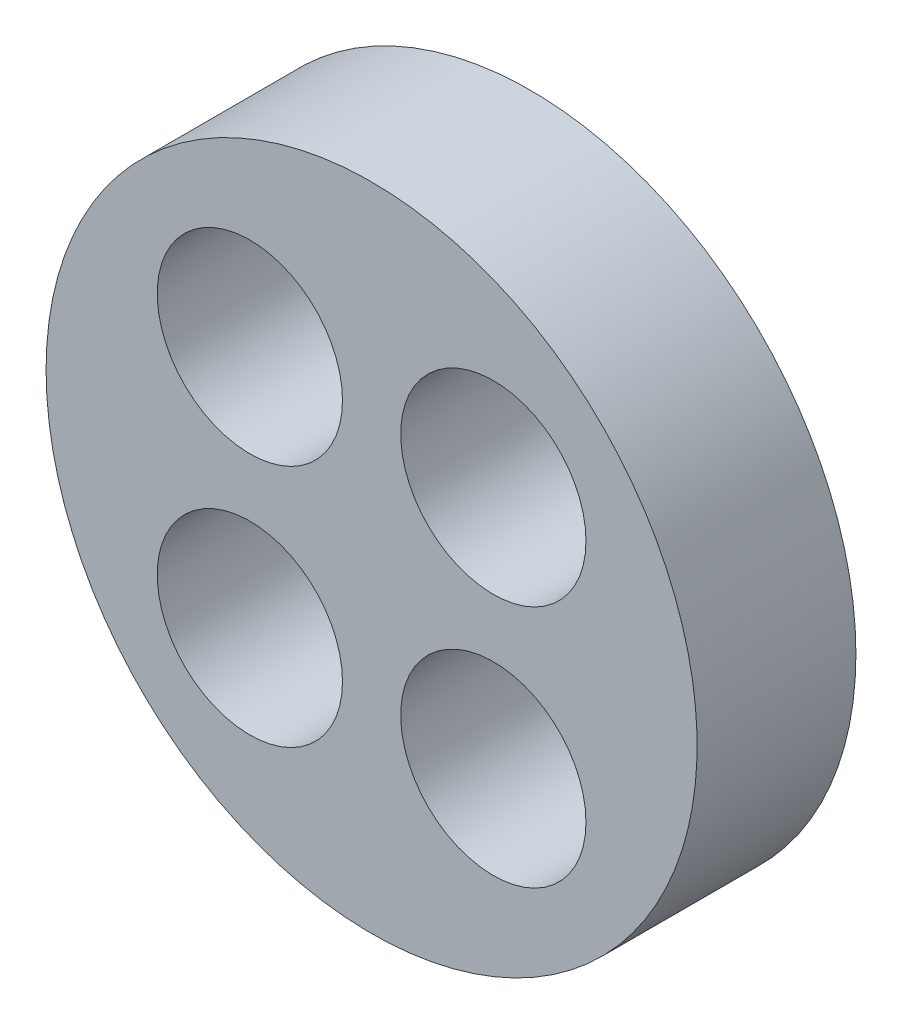
ISO-10303-21;
HEADER;
FILE_DESCRIPTION(('STEP AP214'),'2;1');
FILE_NAME('part.step','',(''),(''),'','','');
FILE_SCHEMA(('AUTOMOTIVE_DESIGN { 1 0 10303 214 1 1 1 1 }'));
ENDSEC;
DATA;
#1=APPLICATION_CONTEXT('core data for automotive mechanical design processes');
#2=APPLICATION_PROTOCOL_DEFINITION('international standard','automotive_design',2000,#1);
#3=PRODUCT_CONTEXT('',#1,'mechanical');
#4=PRODUCT('Part','Part','',(#3));
#5=PRODUCT_RELATED_PRODUCT_CATEGORY('part','',(#4));
#6=PRODUCT_DEFINITION_FORMATION('','',#4);
#7=PRODUCT_DEFINITION_CONTEXT('part definition',#1,'design');
#8=PRODUCT_DEFINITION('design','',#6,#7);
#9=PRODUCT_DEFINITION_SHAPE('','',#8);
#10=(LENGTH_UNIT() NAMED_UNIT(*) SI_UNIT(.MILLI.,.METRE.));
#11=(NAMED_UNIT(*) PLANE_ANGLE_UNIT() SI_UNIT($,.RADIAN.));
#12=(NAMED_UNIT(*) SI_UNIT($,.STERADIAN.) SOLID_ANGLE_UNIT());
#13=UNCERTAINTY_MEASURE_WITH_UNIT(LENGTH_MEASURE(1.E-05),#10,'distance_accuracy_value','');
#14=(GEOMETRIC_REPRESENTATION_CONTEXT(3) GLOBAL_UNCERTAINTY_ASSIGNED_CONTEXT((#13)) GLOBAL_UNIT_ASSIGNED_CONTEXT((#10,
#11,#12)) REPRESENTATION_CONTEXT('',''));
#15=CARTESIAN_POINT('',(0.,0.,0.));
#16=DIRECTION('',(0.,0.,1.));
#17=DIRECTION('',(1.,0.,0.));
#18=AXIS2_PLACEMENT_3D('',#15,#16,#17);
#19=CARTESIAN_POINT('',(0.,0.,0.));
#20=DIRECTION('',(0.,0.,-1.));
#21=DIRECTION('',(-1.,0.,0.));
#22=AXIS2_PLACEMENT_3D('',#19,#20,#21);
#23=PLANE('',#22);
#24=CARTESIAN_POINT('',(0.5842,0.5842,0.));
#25=DIRECTION('',(0.,0.,1.));
#26=DIRECTION('',(1.,0.,0.));
#27=AXIS2_PLACEMENT_3D('',#24,#25,#26);
#28=CIRCLE('',#27,0.44449999999999);
#29=CARTESIAN_POINT('',(1.02869999999999,0.5842,0.));
#30=VERTEX_POINT('',#29);
#31=EDGE_CURVE('E55',#30,#30,#28,.T.);
#32=ORIENTED_EDGE('',*,*,#31,.F.);
#33=EDGE_LOOP('',(#32));
#34=FACE_BOUND('',#33,.T.);
#35=CARTESIAN_POINT('',(-0.5842,0.5842,0.));
#36=DIRECTION('',(0.,0.,1.));
#37=DIRECTION('',(1.,0.,0.));
#38=AXIS2_PLACEMENT_3D('',#35,#36,#37);
#39=CIRCLE('',#38,0.44449999999999);
#40=CARTESIAN_POINT('',(-0.13970000000001,0.5842,0.));
#41=VERTEX_POINT('',#40);
#42=EDGE_CURVE('E52',#41,#41,#39,.T.);
#43=ORIENTED_EDGE('',*,*,#42,.F.);
#44=EDGE_LOOP('',(#43));
#45=FACE_BOUND('',#44,.T.);
#46=CARTESIAN_POINT('',(-0.5842,-0.5842,0.));
#47=DIRECTION('',(0.,0.,1.));
#48=DIRECTION('',(1.,0.,0.));
#49=AXIS2_PLACEMENT_3D('',#46,#47,#48);
#50=CIRCLE('',#49,0.44449999999999);
#51=CARTESIAN_POINT('',(-0.13970000000001,-0.5842,0.));
#52=VERTEX_POINT('',#51);
#53=EDGE_CURVE('E47',#52,#52,#50,.T.);
#54=ORIENTED_EDGE('',*,*,#53,.F.);
#55=EDGE_LOOP('',(#54));
#56=FACE_BOUND('',#55,.T.);
#57=CARTESIAN_POINT('',(0.5842,-0.5842,0.));
#58=DIRECTION('',(0.,0.,1.));
#59=DIRECTION('',(1.,0.,0.));
#60=AXIS2_PLACEMENT_3D('',#57,#58,#59);
#61=CIRCLE('',#60,0.44449999999999);
#62=CARTESIAN_POINT('',(1.02869999999999,-0.5842,0.));
#63=VERTEX_POINT('',#62);
#64=EDGE_CURVE('E43',#63,#63,#61,.T.);
#65=ORIENTED_EDGE('',*,*,#64,.F.);
#66=EDGE_LOOP('',(#65));
#67=FACE_BOUND('',#66,.T.);
#68=CARTESIAN_POINT('',(0.,0.,0.));
#69=DIRECTION('',(0.,0.,-1.));
#70=DIRECTION('',(-1.,0.,0.));
#71=AXIS2_PLACEMENT_3D('',#68,#69,#70);
#72=CIRCLE('',#71,1.5621);
#73=CARTESIAN_POINT('',(-1.5621,0.,0.));
#74=VERTEX_POINT('',#73);
#75=EDGE_CURVE('E11',#74,#74,#72,.T.);
#76=ORIENTED_EDGE('',*,*,#75,.F.);
#77=EDGE_LOOP('',(#76));
#78=FACE_BOUND('',#77,.T.);
#79=ADVANCED_FACE('F36',(#34,#45,#56,#67,#78),#23,.F.);
#80=CARTESIAN_POINT('',(0.,0.,1.43218634124764));
#81=DIRECTION('',(0.,0.,-1.));
#82=DIRECTION('',(-1.,0.,0.));
#83=AXIS2_PLACEMENT_3D('',#80,#81,#82);
#84=CYLINDRICAL_SURFACE('',#83,1.5621);
#85=CARTESIAN_POINT('',(0.,0.,-0.762000000000001));
#86=DIRECTION('',(0.,0.,1.));
#87=DIRECTION('',(1.,0.,0.));
#88=AXIS2_PLACEMENT_3D('',#85,#86,#87);
#89=CIRCLE('',#88,1.5621);
#90=CARTESIAN_POINT('',(1.5621,0.,-0.762000000000001));
#91=VERTEX_POINT('',#90);
#92=EDGE_CURVE('E57',#91,#91,#89,.T.);
#93=ORIENTED_EDGE('',*,*,#92,.T.);
#94=EDGE_LOOP('',(#93));
#95=FACE_BOUND('',#94,.T.);
#96=ORIENTED_EDGE('',*,*,#75,.T.);
#97=EDGE_LOOP('',(#96));
#98=FACE_BOUND('',#97,.T.);
#99=ADVANCED_FACE('F94',(#95,#98),#84,.T.);
#100=CARTESIAN_POINT('',(0.5842,-0.5842,0.));
#101=DIRECTION('',(0.,0.,1.));
#102=DIRECTION('',(1.,0.,0.));
#103=AXIS2_PLACEMENT_3D('',#100,#101,#102);
#104=CYLINDRICAL_SURFACE('',#103,0.444499999999989);
#105=CARTESIAN_POINT('',(0.5842,-0.5842,-0.762000000000001));
#106=DIRECTION('',(0.,0.,1.));
#107=DIRECTION('',(1.,0.,0.));
#108=AXIS2_PLACEMENT_3D('',#105,#106,#107);
#109=CIRCLE('',#108,0.444499999999989);
#110=CARTESIAN_POINT('',(1.02869999999999,-0.5842,-0.762000000000001));
#111=VERTEX_POINT('',#110);
#112=EDGE_CURVE('E62',#111,#111,#109,.F.);
#113=ORIENTED_EDGE('',*,*,#112,.T.);
#114=EDGE_LOOP('',(#113));
#115=FACE_BOUND('',#114,.T.);
#116=ORIENTED_EDGE('',*,*,#64,.T.);
#117=EDGE_LOOP('',(#116));
#118=FACE_BOUND('',#117,.T.);
#119=ADVANCED_FACE('F96',(#115,#118),#104,.F.);
#120=CARTESIAN_POINT('',(-0.5842,-0.5842,0.));
#121=DIRECTION('',(0.,0.,1.));
#122=DIRECTION('',(1.,0.,0.));
#123=AXIS2_PLACEMENT_3D('',#120,#121,#122);
#124=CYLINDRICAL_SURFACE('',#123,0.444499999999989);
#125=CARTESIAN_POINT('',(-0.5842,-0.5842,-0.762000000000001));
#126=DIRECTION('',(0.,0.,1.));
#127=DIRECTION('',(1.,0.,0.));
#128=AXIS2_PLACEMENT_3D('',#125,#126,#127);
#129=CIRCLE('',#128,0.444499999999989);
#130=CARTESIAN_POINT('',(-0.139700000000011,-0.5842,-0.762000000000001));
#131=VERTEX_POINT('',#130);
#132=EDGE_CURVE('E66',#131,#131,#129,.F.);
#133=ORIENTED_EDGE('',*,*,#132,.T.);
#134=EDGE_LOOP('',(#133));
#135=FACE_BOUND('',#134,.T.);
#136=ORIENTED_EDGE('',*,*,#53,.T.);
#137=EDGE_LOOP('',(#136));
#138=FACE_BOUND('',#137,.T.);
#139=ADVANCED_FACE('F100',(#135,#138),#124,.F.);
#140=CARTESIAN_POINT('',(-0.5842,0.5842,0.));
#141=DIRECTION('',(0.,0.,1.));
#142=DIRECTION('',(1.,0.,0.));
#143=AXIS2_PLACEMENT_3D('',#140,#141,#142);
#144=CYLINDRICAL_SURFACE('',#143,0.444499999999989);
#145=CARTESIAN_POINT('',(-0.5842,0.5842,-0.762000000000001));
#146=DIRECTION('',(0.,0.,1.));
#147=DIRECTION('',(1.,0.,0.));
#148=AXIS2_PLACEMENT_3D('',#145,#146,#147);
#149=CIRCLE('',#148,0.444499999999989);
#150=CARTESIAN_POINT('',(-0.139700000000011,0.5842,-0.762000000000001));
#151=VERTEX_POINT('',#150);
#152=EDGE_CURVE('E70',#151,#151,#149,.F.);
#153=ORIENTED_EDGE('',*,*,#152,.T.);
#154=EDGE_LOOP('',(#153));
#155=FACE_BOUND('',#154,.T.);
#156=ORIENTED_EDGE('',*,*,#42,.T.);
#157=EDGE_LOOP('',(#156));
#158=FACE_BOUND('',#157,.T.);
#159=ADVANCED_FACE('F107',(#155,#158),#144,.F.);
#160=CARTESIAN_POINT('',(0.5842,0.5842,0.));
#161=DIRECTION('',(0.,0.,1.));
#162=DIRECTION('',(1.,0.,0.));
#163=AXIS2_PLACEMENT_3D('',#160,#161,#162);
#164=CYLINDRICAL_SURFACE('',#163,0.444499999999989);
#165=CARTESIAN_POINT('',(0.5842,0.5842,-0.762000000000001));
#166=DIRECTION('',(0.,0.,1.));
#167=DIRECTION('',(1.,0.,0.));
#168=AXIS2_PLACEMENT_3D('',#165,#166,#167);
#169=CIRCLE('',#168,0.444499999999989);
#170=CARTESIAN_POINT('',(1.02869999999999,0.5842,-0.762000000000001));
#171=VERTEX_POINT('',#170);
#172=EDGE_CURVE('E39',#171,#171,#169,.F.);
#173=ORIENTED_EDGE('',*,*,#172,.T.);
#174=EDGE_LOOP('',(#173));
#175=FACE_BOUND('',#174,.T.);
#176=ORIENTED_EDGE('',*,*,#31,.T.);
#177=EDGE_LOOP('',(#176));
#178=FACE_BOUND('',#177,.T.);
#179=ADVANCED_FACE('F82',(#175,#178),#164,.F.);
#180=CARTESIAN_POINT('',(-3.81,7.62,-0.762000000000001));
#181=DIRECTION('',(0.,0.,1.));
#182=DIRECTION('',(1.,0.,0.));
#183=AXIS2_PLACEMENT_3D('',#180,#181,#182);
#184=PLANE('',#183);
#185=ORIENTED_EDGE('',*,*,#112,.F.);
#186=EDGE_LOOP('',(#185));
#187=FACE_BOUND('',#186,.T.);
#188=ORIENTED_EDGE('',*,*,#152,.F.);
#189=EDGE_LOOP('',(#188));
#190=FACE_BOUND('',#189,.T.);
#191=ORIENTED_EDGE('',*,*,#172,.F.);
#192=EDGE_LOOP('',(#191));
#193=FACE_BOUND('',#192,.T.);
#194=ORIENTED_EDGE('',*,*,#132,.F.);
#195=EDGE_LOOP('',(#194));
#196=FACE_BOUND('',#195,.T.);
#197=ORIENTED_EDGE('',*,*,#92,.F.);
#198=EDGE_LOOP('',(#197));
#199=FACE_BOUND('',#198,.T.);
#200=ADVANCED_FACE('F85',(#187,#190,#193,#196,#199),#184,.F.);
#201=CLOSED_SHELL('',(#79,#99,#119,#139,#159,#179,#200));
#202=MANIFOLD_SOLID_BREP('B2',#201);
#203=ADVANCED_BREP_SHAPE_REPRESENTATION('',(#18,#202),#14);
#204=SHAPE_DEFINITION_REPRESENTATION(#9,#203);
ENDSEC;
END-ISO-10303-21;
